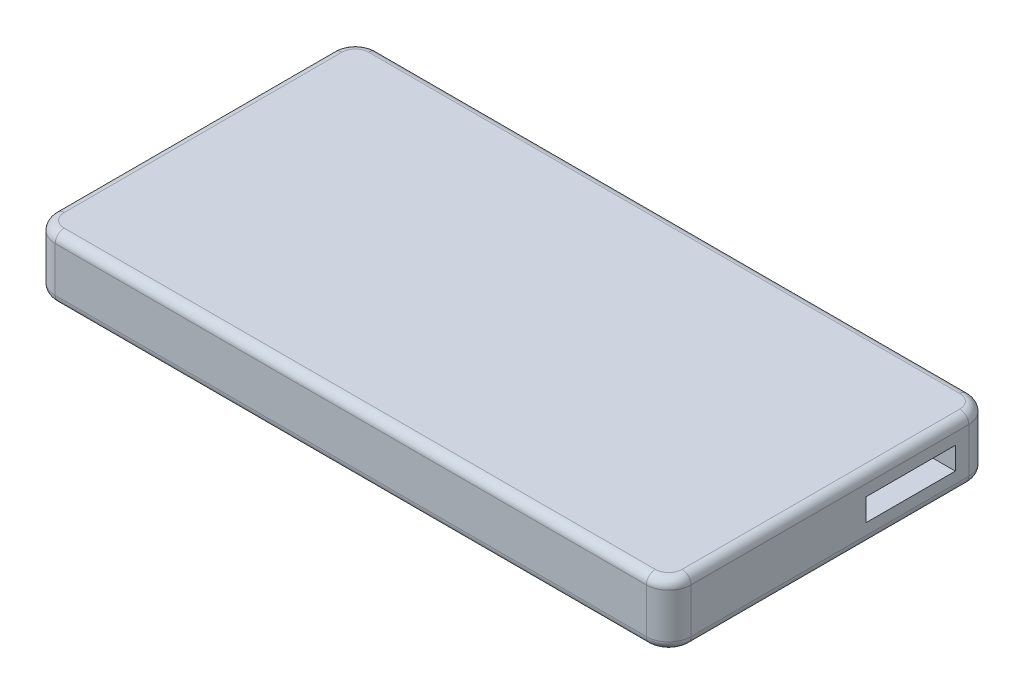
ISO-10303-21;
HEADER;
FILE_DESCRIPTION(('STEP AP214'),'2;1');
FILE_NAME('part.step','',(''),(''),'','','');
FILE_SCHEMA(('AUTOMOTIVE_DESIGN { 1 0 10303 214 1 1 1 1 }'));
ENDSEC;
DATA;
#1=APPLICATION_CONTEXT('core data for automotive mechanical design processes');
#2=APPLICATION_PROTOCOL_DEFINITION('international standard','automotive_design',2000,#1);
#3=PRODUCT_CONTEXT('',#1,'mechanical');
#4=PRODUCT('Part','Part','',(#3));
#5=PRODUCT_RELATED_PRODUCT_CATEGORY('part','',(#4));
#6=PRODUCT_DEFINITION_FORMATION('','',#4);
#7=PRODUCT_DEFINITION_CONTEXT('part definition',#1,'design');
#8=PRODUCT_DEFINITION('design','',#6,#7);
#9=PRODUCT_DEFINITION_SHAPE('','',#8);
#10=(LENGTH_UNIT() NAMED_UNIT(*) SI_UNIT(.MILLI.,.METRE.));
#11=(NAMED_UNIT(*) PLANE_ANGLE_UNIT() SI_UNIT($,.RADIAN.));
#12=(NAMED_UNIT(*) SI_UNIT($,.STERADIAN.) SOLID_ANGLE_UNIT());
#13=UNCERTAINTY_MEASURE_WITH_UNIT(LENGTH_MEASURE(1.E-05),#10,'distance_accuracy_value','');
#14=(GEOMETRIC_REPRESENTATION_CONTEXT(3) GLOBAL_UNCERTAINTY_ASSIGNED_CONTEXT((#13)) GLOBAL_UNIT_ASSIGNED_CONTEXT((#10,
#11,#12)) REPRESENTATION_CONTEXT('',''));
#15=CARTESIAN_POINT('',(0.,0.,0.));
#16=DIRECTION('',(0.,0.,1.));
#17=DIRECTION('',(1.,0.,0.));
#18=AXIS2_PLACEMENT_3D('',#15,#16,#17);
#19=CARTESIAN_POINT('',(-111.451663584206,8.99999999993741,-100.777598009267));
#20=DIRECTION('',(0.,-1.,0.));
#21=DIRECTION('',(0.,0.,-1.));
#22=AXIS2_PLACEMENT_3D('',#19,#20,#21);
#23=CYLINDRICAL_SURFACE('',#22,5.);
#24=DIRECTION('',(0.,-1.,0.));
#25=VECTOR('',#24,1.);
#26=CARTESIAN_POINT('',(-111.451663584206,8.99999999993751,-105.777598009267));
#27=LINE('',#26,#25);
#28=CARTESIAN_POINT('',(-111.451663584206,6.99999999993751,-105.777598009267));
#29=VERTEX_POINT('',#28);
#30=CARTESIAN_POINT('',(-111.451663584206,-3.00000000006249,-105.777598009267));
#31=VERTEX_POINT('',#30);
#32=EDGE_CURVE('E216',#29,#31,#27,.T.);
#33=ORIENTED_EDGE('',*,*,#32,.T.);
#34=CARTESIAN_POINT('',(-111.451663584206,-3.00000000006259,-100.777598009267));
#35=DIRECTION('',(0.,-1.,0.));
#36=DIRECTION('',(0.,0.,-1.));
#37=AXIS2_PLACEMENT_3D('',#34,#35,#36);
#38=CIRCLE('',#37,5.);
#39=CARTESIAN_POINT('',(-116.451663584206,-3.00000000006259,-100.777598009267));
#40=VERTEX_POINT('',#39);
#41=EDGE_CURVE('E282',#31,#40,#38,.F.);
#42=ORIENTED_EDGE('',*,*,#41,.T.);
#43=DIRECTION('',(0.,-1.,0.));
#44=VECTOR('',#43,1.);
#45=CARTESIAN_POINT('',(-116.451663584206,8.99999999993741,-100.777598009267));
#46=LINE('',#45,#44);
#47=CARTESIAN_POINT('',(-116.451663584206,6.99999999993741,-100.777598009267));
#48=VERTEX_POINT('',#47);
#49=EDGE_CURVE('E241',#48,#40,#46,.T.);
#50=ORIENTED_EDGE('',*,*,#49,.F.);
#51=CARTESIAN_POINT('',(-111.451663584206,6.99999999993741,-100.777598009267));
#52=DIRECTION('',(0.,-1.,0.));
#53=DIRECTION('',(0.,0.,-1.));
#54=AXIS2_PLACEMENT_3D('',#51,#52,#53);
#55=CIRCLE('',#54,5.);
#56=EDGE_CURVE('E279',#48,#29,#55,.T.);
#57=ORIENTED_EDGE('',*,*,#56,.T.);
#58=EDGE_LOOP('',(#33,#42,#50,#57));
#59=FACE_BOUND('',#58,.T.);
#60=ADVANCED_FACE('F37',(#59),#23,.T.);
#61=CARTESIAN_POINT('',(-116.451663584206,8.99999999993611,-38.7775980092671));
#62=DIRECTION('',(1.,0.,0.));
#63=DIRECTION('',(0.,1.,0.));
#64=AXIS2_PLACEMENT_3D('',#61,#62,#63);
#65=PLANE('',#64);
#66=ORIENTED_EDGE('',*,*,#49,.T.);
#67=DIRECTION('',(0.,0.,1.));
#68=VECTOR('',#67,1.);
#69=CARTESIAN_POINT('',(-116.451663584206,-3.00000000006389,-38.7775980092673));
#70=LINE('',#69,#68);
#71=CARTESIAN_POINT('',(-116.451663584206,-3.00000000006389,-38.7775980092673));
#72=VERTEX_POINT('',#71);
#73=EDGE_CURVE('E276',#40,#72,#70,.T.);
#74=ORIENTED_EDGE('',*,*,#73,.T.);
#75=DIRECTION('',(0.,-1.,0.));
#76=VECTOR('',#75,1.);
#77=CARTESIAN_POINT('',(-116.451663584206,8.99999999993611,-38.7775980092671));
#78=LINE('',#77,#76);
#79=CARTESIAN_POINT('',(-116.451663584206,6.99999999993611,-38.7775980092671));
#80=VERTEX_POINT('',#79);
#81=EDGE_CURVE('E238',#80,#72,#78,.T.);
#82=ORIENTED_EDGE('',*,*,#81,.F.);
#83=DIRECTION('',(0.,0.,1.));
#84=VECTOR('',#83,1.);
#85=CARTESIAN_POINT('',(-116.451663584206,6.99999999993611,-38.7775980092671));
#86=LINE('',#85,#84);
#87=EDGE_CURVE('E273',#80,#48,#86,.F.);
#88=ORIENTED_EDGE('',*,*,#87,.T.);
#89=EDGE_LOOP('',(#66,#74,#82,#88));
#90=FACE_BOUND('',#89,.T.);
#91=ADVANCED_FACE('F433',(#90),#65,.F.);
#92=CARTESIAN_POINT('',(-111.451663584206,8.99999999993611,-38.777598009267));
#93=DIRECTION('',(0.,-1.,0.));
#94=DIRECTION('',(0.,0.,-1.));
#95=AXIS2_PLACEMENT_3D('',#92,#93,#94);
#96=CYLINDRICAL_SURFACE('',#95,5.);
#97=ORIENTED_EDGE('',*,*,#81,.T.);
#98=CARTESIAN_POINT('',(-111.451663584206,-3.00000000006389,-38.7775980092673));
#99=DIRECTION('',(0.,-1.,0.));
#100=DIRECTION('',(0.,0.,-1.));
#101=AXIS2_PLACEMENT_3D('',#98,#99,#100);
#102=CIRCLE('',#101,5.);
#103=CARTESIAN_POINT('',(-111.451663584206,-3.000000000064,-33.7775980092673));
#104=VERTEX_POINT('',#103);
#105=EDGE_CURVE('E249',#72,#104,#102,.F.);
#106=ORIENTED_EDGE('',*,*,#105,.T.);
#107=DIRECTION('',(0.,-1.,0.));
#108=VECTOR('',#107,1.);
#109=CARTESIAN_POINT('',(-111.451663584206,8.999999999936,-33.777598009267));
#110=LINE('',#109,#108);
#111=CARTESIAN_POINT('',(-111.451663584206,6.999999999936,-33.7775980092671));
#112=VERTEX_POINT('',#111);
#113=EDGE_CURVE('E234',#112,#104,#110,.T.);
#114=ORIENTED_EDGE('',*,*,#113,.F.);
#115=CARTESIAN_POINT('',(-111.451663584206,6.99999999993611,-38.7775980092671));
#116=DIRECTION('',(0.,-1.,0.));
#117=DIRECTION('',(0.,0.,-1.));
#118=AXIS2_PLACEMENT_3D('',#115,#116,#117);
#119=CIRCLE('',#118,5.);
#120=EDGE_CURVE('E245',#112,#80,#119,.T.);
#121=ORIENTED_EDGE('',*,*,#120,.T.);
#122=EDGE_LOOP('',(#97,#106,#114,#121));
#123=FACE_BOUND('',#122,.T.);
#124=ADVANCED_FACE('F435',(#123),#96,.T.);
#125=CARTESIAN_POINT('',(-111.451663584206,8.999999999936,-33.777598009267));
#126=DIRECTION('',(0.,0.,-1.));
#127=DIRECTION('',(0.,1.,0.));
#128=AXIS2_PLACEMENT_3D('',#125,#126,#127);
#129=PLANE('',#128);
#130=ORIENTED_EDGE('',*,*,#113,.T.);
#131=DIRECTION('',(1.,0.,0.));
#132=VECTOR('',#131,1.);
#133=CARTESIAN_POINT('',(20.5483364157936,-3.00000000006401,-33.7775980092673));
#134=LINE('',#133,#132);
#135=CARTESIAN_POINT('',(20.5483364157936,-3.00000000006401,-33.7775980092673));
#136=VERTEX_POINT('',#135);
#137=EDGE_CURVE('E11',#104,#136,#134,.T.);
#138=ORIENTED_EDGE('',*,*,#137,.T.);
#139=DIRECTION('',(0.,-1.,0.));
#140=VECTOR('',#139,1.);
#141=CARTESIAN_POINT('',(20.5483364157936,8.99999999993599,-33.777598009267));
#142=LINE('',#141,#140);
#143=CARTESIAN_POINT('',(20.5483364157936,6.99999999993599,-33.7775980092671));
#144=VERTEX_POINT('',#143);
#145=EDGE_CURVE('E231',#144,#136,#142,.T.);
#146=ORIENTED_EDGE('',*,*,#145,.F.);
#147=DIRECTION('',(1.,0.,0.));
#148=VECTOR('',#147,1.);
#149=CARTESIAN_POINT('',(-111.451663584206,6.999999999936,-33.7775980092671));
#150=LINE('',#149,#148);
#151=EDGE_CURVE('E47',#144,#112,#150,.F.);
#152=ORIENTED_EDGE('',*,*,#151,.T.);
#153=EDGE_LOOP('',(#130,#138,#146,#152));
#154=FACE_BOUND('',#153,.T.);
#155=ADVANCED_FACE('F556',(#154),#129,.F.);
#156=CARTESIAN_POINT('',(20.5483364157937,8.9999999999361,-38.777598009267));
#157=DIRECTION('',(0.,-1.,0.));
#158=DIRECTION('',(0.,0.,-1.));
#159=AXIS2_PLACEMENT_3D('',#156,#157,#158);
#160=CYLINDRICAL_SURFACE('',#159,5.);
#161=ORIENTED_EDGE('',*,*,#145,.T.);
#162=CARTESIAN_POINT('',(20.5483364157937,-3.0000000000639,-38.7775980092673));
#163=DIRECTION('',(0.,-1.,0.));
#164=DIRECTION('',(0.,0.,-1.));
#165=AXIS2_PLACEMENT_3D('',#162,#163,#164);
#166=CIRCLE('',#165,5.);
#167=CARTESIAN_POINT('',(25.5483364157937,-3.0000000000639,-38.7775980092673));
#168=VERTEX_POINT('',#167);
#169=EDGE_CURVE('E304',#136,#168,#166,.F.);
#170=ORIENTED_EDGE('',*,*,#169,.T.);
#171=DIRECTION('',(0.,-1.,0.));
#172=VECTOR('',#171,1.);
#173=CARTESIAN_POINT('',(25.5483364157937,8.9999999999361,-38.7775980092671));
#174=LINE('',#173,#172);
#175=CARTESIAN_POINT('',(25.5483364157937,6.9999999999361,-38.7775980092671));
#176=VERTEX_POINT('',#175);
#177=EDGE_CURVE('E227',#176,#168,#174,.T.);
#178=ORIENTED_EDGE('',*,*,#177,.F.);
#179=CARTESIAN_POINT('',(20.5483364157937,6.9999999999361,-38.7775980092671));
#180=DIRECTION('',(0.,-1.,0.));
#181=DIRECTION('',(0.,0.,-1.));
#182=AXIS2_PLACEMENT_3D('',#179,#180,#181);
#183=CIRCLE('',#182,5.);
#184=EDGE_CURVE('E301',#176,#144,#183,.T.);
#185=ORIENTED_EDGE('',*,*,#184,.T.);
#186=EDGE_LOOP('',(#161,#170,#178,#185));
#187=FACE_BOUND('',#186,.T.);
#188=ADVANCED_FACE('F560',(#187),#160,.T.);
#189=CARTESIAN_POINT('',(25.5483364157937,8.9999999999361,-38.7775980092671));
#190=DIRECTION('',(-1.,0.,0.));
#191=DIRECTION('',(0.,-1.,0.));
#192=AXIS2_PLACEMENT_3D('',#189,#190,#191);
#193=PLANE('',#192);
#194=DIRECTION('',(0.,0.,1.));
#195=VECTOR('',#194,1.);
#196=CARTESIAN_POINT('',(25.5483364157937,4.4999999999375,-97.7775980092673));
#197=LINE('',#196,#195);
#198=CARTESIAN_POINT('',(25.5483364157937,4.4999999999375,-97.7775980092673));
#199=VERTEX_POINT('',#198);
#200=CARTESIAN_POINT('',(25.5483364157937,4.4999999999375,-77.7775980092673));
#201=VERTEX_POINT('',#200);
#202=EDGE_CURVE('E206',#199,#201,#197,.T.);
#203=ORIENTED_EDGE('',*,*,#202,.F.);
#204=DIRECTION('',(0.,1.,0.));
#205=VECTOR('',#204,1.);
#206=CARTESIAN_POINT('',(25.5483364157937,-0.500000000062495,-97.7775980092673));
#207=LINE('',#206,#205);
#208=CARTESIAN_POINT('',(25.5483364157937,-0.500000000062495,-97.7775980092673));
#209=VERTEX_POINT('',#208);
#210=EDGE_CURVE('E55',#209,#199,#207,.T.);
#211=ORIENTED_EDGE('',*,*,#210,.F.);
#212=DIRECTION('',(0.,0.,-1.));
#213=VECTOR('',#212,1.);
#214=CARTESIAN_POINT('',(25.5483364157937,-0.500000000062495,-97.7775980092673));
#215=LINE('',#214,#213);
#216=CARTESIAN_POINT('',(25.5483364157937,-0.500000000062497,-77.7775980092673));
#217=VERTEX_POINT('',#216);
#218=EDGE_CURVE('E197',#217,#209,#215,.T.);
#219=ORIENTED_EDGE('',*,*,#218,.F.);
#220=DIRECTION('',(0.,-1.,0.));
#221=VECTOR('',#220,1.);
#222=CARTESIAN_POINT('',(25.5483364157937,-0.500000000062497,-77.7775980092673));
#223=LINE('',#222,#221);
#224=EDGE_CURVE('E200',#201,#217,#223,.T.);
#225=ORIENTED_EDGE('',*,*,#224,.F.);
#226=EDGE_LOOP('',(#203,#211,#219,#225));
#227=FACE_BOUND('',#226,.T.);
#228=ORIENTED_EDGE('',*,*,#177,.T.);
#229=DIRECTION('',(0.,0.,-1.));
#230=VECTOR('',#229,1.);
#231=CARTESIAN_POINT('',(25.5483364157937,-3.0000000000626,-100.777598009267));
#232=LINE('',#231,#230);
#233=CARTESIAN_POINT('',(25.5483364157937,-3.0000000000626,-100.777598009267));
#234=VERTEX_POINT('',#233);
#235=EDGE_CURVE('E298',#168,#234,#232,.T.);
#236=ORIENTED_EDGE('',*,*,#235,.T.);
#237=DIRECTION('',(0.,-1.,0.));
#238=VECTOR('',#237,1.);
#239=CARTESIAN_POINT('',(25.5483364157937,8.9999999999374,-100.777598009267));
#240=LINE('',#239,#238);
#241=CARTESIAN_POINT('',(25.5483364157937,6.9999999999374,-100.777598009267));
#242=VERTEX_POINT('',#241);
#243=EDGE_CURVE('E224',#242,#234,#240,.T.);
#244=ORIENTED_EDGE('',*,*,#243,.F.);
#245=DIRECTION('',(0.,0.,-1.));
#246=VECTOR('',#245,1.);
#247=CARTESIAN_POINT('',(25.5483364157937,6.9999999999361,-38.7775980092671));
#248=LINE('',#247,#246);
#249=EDGE_CURVE('E295',#242,#176,#248,.F.);
#250=ORIENTED_EDGE('',*,*,#249,.T.);
#251=EDGE_LOOP('',(#228,#236,#244,#250));
#252=FACE_BOUND('',#251,.T.);
#253=ADVANCED_FACE('F388',(#227,#252),#193,.F.);
#254=CARTESIAN_POINT('',(20.5483364157937,8.9999999999374,-100.777598009267));
#255=DIRECTION('',(0.,-1.,0.));
#256=DIRECTION('',(0.,0.,-1.));
#257=AXIS2_PLACEMENT_3D('',#254,#255,#256);
#258=CYLINDRICAL_SURFACE('',#257,5.);
#259=ORIENTED_EDGE('',*,*,#243,.T.);
#260=CARTESIAN_POINT('',(20.5483364157937,-3.0000000000626,-100.777598009267));
#261=DIRECTION('',(0.,-1.,0.));
#262=DIRECTION('',(0.,0.,-1.));
#263=AXIS2_PLACEMENT_3D('',#260,#261,#262);
#264=CIRCLE('',#263,5.);
#265=CARTESIAN_POINT('',(20.5483364157936,-3.00000000006249,-105.777598009267));
#266=VERTEX_POINT('',#265);
#267=EDGE_CURVE('E293',#234,#266,#264,.F.);
#268=ORIENTED_EDGE('',*,*,#267,.T.);
#269=DIRECTION('',(0.,-1.,0.));
#270=VECTOR('',#269,1.);
#271=CARTESIAN_POINT('',(20.5483364157936,8.99999999993751,-105.777598009267));
#272=LINE('',#271,#270);
#273=CARTESIAN_POINT('',(20.5483364157936,6.99999999993751,-105.777598009267));
#274=VERTEX_POINT('',#273);
#275=EDGE_CURVE('E219',#274,#266,#272,.T.);
#276=ORIENTED_EDGE('',*,*,#275,.F.);
#277=CARTESIAN_POINT('',(20.5483364157937,6.9999999999374,-100.777598009267));
#278=DIRECTION('',(0.,-1.,0.));
#279=DIRECTION('',(0.,0.,-1.));
#280=AXIS2_PLACEMENT_3D('',#277,#278,#279);
#281=CIRCLE('',#280,5.);
#282=EDGE_CURVE('E290',#274,#242,#281,.T.);
#283=ORIENTED_EDGE('',*,*,#282,.T.);
#284=EDGE_LOOP('',(#259,#268,#276,#283));
#285=FACE_BOUND('',#284,.T.);
#286=ADVANCED_FACE('F385',(#285),#258,.T.);
#287=CARTESIAN_POINT('',(-111.451663584206,8.99999999993751,-105.777598009267));
#288=DIRECTION('',(0.,0.,1.));
#289=DIRECTION('',(0.,-1.,0.));
#290=AXIS2_PLACEMENT_3D('',#287,#288,#289);
#291=PLANE('',#290);
#292=ORIENTED_EDGE('',*,*,#275,.T.);
#293=DIRECTION('',(-1.,0.,0.));
#294=VECTOR('',#293,1.);
#295=CARTESIAN_POINT('',(-111.451663584206,-3.00000000006249,-105.777598009267));
#296=LINE('',#295,#294);
#297=EDGE_CURVE('E287',#266,#31,#296,.T.);
#298=ORIENTED_EDGE('',*,*,#297,.T.);
#299=ORIENTED_EDGE('',*,*,#32,.F.);
#300=DIRECTION('',(-1.,0.,0.));
#301=VECTOR('',#300,1.);
#302=CARTESIAN_POINT('',(-111.451663584206,6.99999999993751,-105.777598009267));
#303=LINE('',#302,#301);
#304=EDGE_CURVE('E284',#29,#274,#303,.F.);
#305=ORIENTED_EDGE('',*,*,#304,.T.);
#306=EDGE_LOOP('',(#292,#298,#299,#305));
#307=FACE_BOUND('',#306,.T.);
#308=ADVANCED_FACE('F412',(#307),#291,.F.);
#309=CARTESIAN_POINT('',(-111.451663584206,8.99999999993741,-100.777598009267));
#310=DIRECTION('',(0.,-1.,0.));
#311=DIRECTION('',(0.,0.,-1.));
#312=AXIS2_PLACEMENT_3D('',#309,#310,#311);
#313=PLANE('',#312);
#314=DIRECTION('',(0.,0.,1.));
#315=VECTOR('',#314,1.);
#316=CARTESIAN_POINT('',(-114.451663584206,8.99999999993741,-100.777598009267));
#317=LINE('',#316,#315);
#318=CARTESIAN_POINT('',(-114.451663584206,8.99999999993741,-100.777598009267));
#319=VERTEX_POINT('',#318);
#320=CARTESIAN_POINT('',(-114.451663584206,8.99999999993611,-38.7775980092671));
#321=VERTEX_POINT('',#320);
#322=EDGE_CURVE('E63',#319,#321,#317,.T.);
#323=ORIENTED_EDGE('',*,*,#322,.T.);
#324=CARTESIAN_POINT('',(-111.451663584206,8.99999999993611,-38.777598009267));
#325=DIRECTION('',(0.,-1.,0.));
#326=DIRECTION('',(0.,0.,-1.));
#327=AXIS2_PLACEMENT_3D('',#324,#325,#326);
#328=CIRCLE('',#327,3.);
#329=CARTESIAN_POINT('',(-111.451663584206,8.99999999993604,-35.777598009267));
#330=VERTEX_POINT('',#329);
#331=EDGE_CURVE('E325',#321,#330,#328,.F.);
#332=ORIENTED_EDGE('',*,*,#331,.T.);
#333=DIRECTION('',(1.,0.,0.));
#334=VECTOR('',#333,1.);
#335=CARTESIAN_POINT('',(-111.451663584206,8.99999999993604,-35.777598009267));
#336=LINE('',#335,#334);
#337=CARTESIAN_POINT('',(20.5483364157936,8.99999999993604,-35.777598009267));
#338=VERTEX_POINT('',#337);
#339=EDGE_CURVE('E307',#330,#338,#336,.T.);
#340=ORIENTED_EDGE('',*,*,#339,.T.);
#341=CARTESIAN_POINT('',(20.5483364157937,8.9999999999361,-38.777598009267));
#342=DIRECTION('',(0.,-1.,0.));
#343=DIRECTION('',(0.,0.,-1.));
#344=AXIS2_PLACEMENT_3D('',#341,#342,#343);
#345=CIRCLE('',#344,3.);
#346=CARTESIAN_POINT('',(23.5483364157937,8.9999999999361,-38.7775980092671));
#347=VERTEX_POINT('',#346);
#348=EDGE_CURVE('E310',#338,#347,#345,.F.);
#349=ORIENTED_EDGE('',*,*,#348,.T.);
#350=DIRECTION('',(0.,0.,-1.));
#351=VECTOR('',#350,1.);
#352=CARTESIAN_POINT('',(23.5483364157937,8.9999999999374,-100.777598009267));
#353=LINE('',#352,#351);
#354=CARTESIAN_POINT('',(23.5483364157937,8.9999999999374,-100.777598009267));
#355=VERTEX_POINT('',#354);
#356=EDGE_CURVE('E312',#347,#355,#353,.T.);
#357=ORIENTED_EDGE('',*,*,#356,.T.);
#358=CARTESIAN_POINT('',(20.5483364157937,8.9999999999374,-100.777598009267));
#359=DIRECTION('',(0.,-1.,0.));
#360=DIRECTION('',(0.,0.,-1.));
#361=AXIS2_PLACEMENT_3D('',#358,#359,#360);
#362=CIRCLE('',#361,3.);
#363=CARTESIAN_POINT('',(20.5483364157936,8.99999999993747,-103.777598009267));
#364=VERTEX_POINT('',#363);
#365=EDGE_CURVE('E315',#355,#364,#362,.F.);
#366=ORIENTED_EDGE('',*,*,#365,.T.);
#367=DIRECTION('',(-1.,0.,0.));
#368=VECTOR('',#367,1.);
#369=CARTESIAN_POINT('',(-111.451663584206,8.99999999993747,-103.777598009267));
#370=LINE('',#369,#368);
#371=CARTESIAN_POINT('',(-111.451663584206,8.99999999993747,-103.777598009267));
#372=VERTEX_POINT('',#371);
#373=EDGE_CURVE('E318',#364,#372,#370,.T.);
#374=ORIENTED_EDGE('',*,*,#373,.T.);
#375=CARTESIAN_POINT('',(-111.451663584206,8.99999999993741,-100.777598009267));
#376=DIRECTION('',(0.,-1.,0.));
#377=DIRECTION('',(0.,0.,-1.));
#378=AXIS2_PLACEMENT_3D('',#375,#376,#377);
#379=CIRCLE('',#378,3.);
#380=EDGE_CURVE('E321',#372,#319,#379,.F.);
#381=ORIENTED_EDGE('',*,*,#380,.T.);
#382=EDGE_LOOP('',(#323,#332,#340,#349,#357,#366,#374,#381));
#383=FACE_BOUND('',#382,.T.);
#384=ADVANCED_FACE('F449',(#383),#313,.F.);
#385=CARTESIAN_POINT('',(-111.451663584206,-5.00000000006259,-100.777598009267));
#386=DIRECTION('',(0.,-1.,0.));
#387=DIRECTION('',(0.,0.,-1.));
#388=AXIS2_PLACEMENT_3D('',#385,#386,#387);
#389=PLANE('',#388);
#390=DIRECTION('',(1.,0.,0.));
#391=VECTOR('',#390,1.);
#392=CARTESIAN_POINT('',(-111.451663584206,-5.00000000006396,-35.7775980092673));
#393=LINE('',#392,#391);
#394=CARTESIAN_POINT('',(20.5483364157936,-5.00000000006396,-35.7775980092673));
#395=VERTEX_POINT('',#394);
#396=CARTESIAN_POINT('',(-111.451663584206,-5.00000000006396,-35.7775980092673));
#397=VERTEX_POINT('',#396);
#398=EDGE_CURVE('E252',#395,#397,#393,.F.);
#399=ORIENTED_EDGE('',*,*,#398,.T.);
#400=CARTESIAN_POINT('',(-111.451663584206,-5.00000000006389,-38.7775980092673));
#401=DIRECTION('',(0.,-1.,0.));
#402=DIRECTION('',(0.,0.,-1.));
#403=AXIS2_PLACEMENT_3D('',#400,#401,#402);
#404=CIRCLE('',#403,3.);
#405=CARTESIAN_POINT('',(-114.451663584206,-5.00000000006389,-38.7775980092673));
#406=VERTEX_POINT('',#405);
#407=EDGE_CURVE('E269',#397,#406,#404,.T.);
#408=ORIENTED_EDGE('',*,*,#407,.T.);
#409=DIRECTION('',(0.,0.,1.));
#410=VECTOR('',#409,1.);
#411=CARTESIAN_POINT('',(-114.451663584206,-5.00000000006259,-100.777598009267));
#412=LINE('',#411,#410);
#413=CARTESIAN_POINT('',(-114.451663584206,-5.00000000006259,-100.777598009267));
#414=VERTEX_POINT('',#413);
#415=EDGE_CURVE('E266',#406,#414,#412,.F.);
#416=ORIENTED_EDGE('',*,*,#415,.T.);
#417=CARTESIAN_POINT('',(-111.451663584206,-5.00000000006259,-100.777598009267));
#418=DIRECTION('',(0.,-1.,0.));
#419=DIRECTION('',(0.,0.,-1.));
#420=AXIS2_PLACEMENT_3D('',#417,#418,#419);
#421=CIRCLE('',#420,3.);
#422=CARTESIAN_POINT('',(-111.451663584206,-5.00000000006253,-103.777598009267));
#423=VERTEX_POINT('',#422);
#424=EDGE_CURVE('E264',#414,#423,#421,.T.);
#425=ORIENTED_EDGE('',*,*,#424,.T.);
#426=DIRECTION('',(-1.,0.,0.));
#427=VECTOR('',#426,1.);
#428=CARTESIAN_POINT('',(20.5483364157936,-5.00000000006253,-103.777598009267));
#429=LINE('',#428,#427);
#430=CARTESIAN_POINT('',(20.5483364157936,-5.00000000006253,-103.777598009267));
#431=VERTEX_POINT('',#430);
#432=EDGE_CURVE('E262',#423,#431,#429,.F.);
#433=ORIENTED_EDGE('',*,*,#432,.T.);
#434=CARTESIAN_POINT('',(20.5483364157937,-5.0000000000626,-100.777598009267));
#435=DIRECTION('',(0.,-1.,0.));
#436=DIRECTION('',(0.,0.,-1.));
#437=AXIS2_PLACEMENT_3D('',#434,#435,#436);
#438=CIRCLE('',#437,3.);
#439=CARTESIAN_POINT('',(23.5483364157937,-5.0000000000626,-100.777598009267));
#440=VERTEX_POINT('',#439);
#441=EDGE_CURVE('E260',#431,#440,#438,.T.);
#442=ORIENTED_EDGE('',*,*,#441,.T.);
#443=DIRECTION('',(0.,0.,-1.));
#444=VECTOR('',#443,1.);
#445=CARTESIAN_POINT('',(23.5483364157937,-5.0000000000639,-38.7775980092674));
#446=LINE('',#445,#444);
#447=CARTESIAN_POINT('',(23.5483364157937,-5.0000000000639,-38.7775980092674));
#448=VERTEX_POINT('',#447);
#449=EDGE_CURVE('E257',#440,#448,#446,.F.);
#450=ORIENTED_EDGE('',*,*,#449,.T.);
#451=CARTESIAN_POINT('',(20.5483364157937,-5.0000000000639,-38.7775980092673));
#452=DIRECTION('',(0.,-1.,0.));
#453=DIRECTION('',(0.,0.,-1.));
#454=AXIS2_PLACEMENT_3D('',#451,#452,#453);
#455=CIRCLE('',#454,3.);
#456=EDGE_CURVE('E255',#448,#395,#455,.T.);
#457=ORIENTED_EDGE('',*,*,#456,.T.);
#458=EDGE_LOOP('',(#399,#408,#416,#425,#433,#442,#450,#457));
#459=FACE_BOUND('',#458,.T.);
#460=ADVANCED_FACE('F403',(#459),#389,.T.);
#461=CARTESIAN_POINT('',(20.5483364157937,-3.0000000000626,-100.777598009267));
#462=DIRECTION('',(0.,-1.,0.));
#463=DIRECTION('',(0.,0.,-1.));
#464=AXIS2_PLACEMENT_3D('',#461,#462,#463);
#465=TOROIDAL_SURFACE('',#464,3.,2.);
#466=CARTESIAN_POINT('',(23.5483364157937,-3.0000000000626,-100.777598009267));
#467=DIRECTION('',(0.,0.,1.));
#468=DIRECTION('',(0.,-1.,0.));
#469=AXIS2_PLACEMENT_3D('',#466,#467,#468);
#470=CIRCLE('',#469,2.);
#471=EDGE_CURVE('E347',#440,#234,#470,.T.);
#472=ORIENTED_EDGE('',*,*,#471,.F.);
#473=ORIENTED_EDGE('',*,*,#441,.F.);
#474=CARTESIAN_POINT('',(20.5483364157936,-3.00000000006254,-103.777598009267));
#475=DIRECTION('',(-1.,0.,0.));
#476=DIRECTION('',(0.,0.,1.));
#477=AXIS2_PLACEMENT_3D('',#474,#475,#476);
#478=CIRCLE('',#477,2.);
#479=EDGE_CURVE('E220',#266,#431,#478,.T.);
#480=ORIENTED_EDGE('',*,*,#479,.F.);
#481=ORIENTED_EDGE('',*,*,#267,.F.);
#482=EDGE_LOOP('',(#472,#473,#480,#481));
#483=FACE_BOUND('',#482,.T.);
#484=ADVANCED_FACE('F409',(#483),#465,.T.);
#485=CARTESIAN_POINT('',(-111.451663584206,-3.00000000006253,-103.777598009267));
#486=DIRECTION('',(1.,0.,0.));
#487=DIRECTION('',(0.,1.,0.));
#488=AXIS2_PLACEMENT_3D('',#485,#486,#487);
#489=CYLINDRICAL_SURFACE('',#488,2.);
#490=ORIENTED_EDGE('',*,*,#479,.T.);
#491=ORIENTED_EDGE('',*,*,#432,.F.);
#492=CARTESIAN_POINT('',(-111.451663584206,-3.00000000006253,-103.777598009267));
#493=DIRECTION('',(-1.,0.,0.));
#494=DIRECTION('',(0.,-1.,0.));
#495=AXIS2_PLACEMENT_3D('',#492,#493,#494);
#496=CIRCLE('',#495,2.);
#497=EDGE_CURVE('E344',#31,#423,#496,.T.);
#498=ORIENTED_EDGE('',*,*,#497,.F.);
#499=ORIENTED_EDGE('',*,*,#297,.F.);
#500=EDGE_LOOP('',(#490,#491,#498,#499));
#501=FACE_BOUND('',#500,.T.);
#502=ADVANCED_FACE('F420',(#501),#489,.T.);
#503=CARTESIAN_POINT('',(23.5483364157937,-3.0000000000639,-38.7775980092673));
#504=DIRECTION('',(0.,0.,1.));
#505=DIRECTION('',(0.,-1.,0.));
#506=AXIS2_PLACEMENT_3D('',#503,#504,#505);
#507=CYLINDRICAL_SURFACE('',#506,2.);
#508=ORIENTED_EDGE('',*,*,#471,.T.);
#509=ORIENTED_EDGE('',*,*,#235,.F.);
#510=CARTESIAN_POINT('',(23.5483364157937,-3.0000000000639,-38.7775980092673));
#511=DIRECTION('',(0.,0.,1.));
#512=DIRECTION('',(0.,-1.,0.));
#513=AXIS2_PLACEMENT_3D('',#510,#511,#512);
#514=CIRCLE('',#513,2.);
#515=EDGE_CURVE('E341',#448,#168,#514,.T.);
#516=ORIENTED_EDGE('',*,*,#515,.F.);
#517=ORIENTED_EDGE('',*,*,#449,.F.);
#518=EDGE_LOOP('',(#508,#509,#516,#517));
#519=FACE_BOUND('',#518,.T.);
#520=ADVANCED_FACE('F393',(#519),#507,.T.);
#521=CARTESIAN_POINT('',(-111.451663584206,-3.00000000006259,-100.777598009267));
#522=DIRECTION('',(0.,-1.,0.));
#523=DIRECTION('',(0.,0.,-1.));
#524=AXIS2_PLACEMENT_3D('',#521,#522,#523);
#525=TOROIDAL_SURFACE('',#524,3.,2.);
#526=ORIENTED_EDGE('',*,*,#497,.T.);
#527=ORIENTED_EDGE('',*,*,#424,.F.);
#528=CARTESIAN_POINT('',(-114.451663584206,-3.00000000006259,-100.777598009267));
#529=DIRECTION('',(0.,0.,1.));
#530=DIRECTION('',(0.,-1.,0.));
#531=AXIS2_PLACEMENT_3D('',#528,#529,#530);
#532=CIRCLE('',#531,2.);
#533=EDGE_CURVE('E338',#40,#414,#532,.T.);
#534=ORIENTED_EDGE('',*,*,#533,.F.);
#535=ORIENTED_EDGE('',*,*,#41,.F.);
#536=EDGE_LOOP('',(#526,#527,#534,#535));
#537=FACE_BOUND('',#536,.T.);
#538=ADVANCED_FACE('F424',(#537),#525,.T.);
#539=CARTESIAN_POINT('',(20.5483364157937,-3.0000000000639,-38.7775980092673));
#540=DIRECTION('',(0.,-1.,0.));
#541=DIRECTION('',(0.,0.,-1.));
#542=AXIS2_PLACEMENT_3D('',#539,#540,#541);
#543=TOROIDAL_SURFACE('',#542,3.,2.);
#544=ORIENTED_EDGE('',*,*,#515,.T.);
#545=ORIENTED_EDGE('',*,*,#169,.F.);
#546=CARTESIAN_POINT('',(20.5483364157936,-3.00000000006396,-35.7775980092673));
#547=DIRECTION('',(-1.,0.,0.));
#548=DIRECTION('',(0.,0.,1.));
#549=AXIS2_PLACEMENT_3D('',#546,#547,#548);
#550=CIRCLE('',#549,2.);
#551=EDGE_CURVE('E334',#395,#136,#550,.T.);
#552=ORIENTED_EDGE('',*,*,#551,.F.);
#553=ORIENTED_EDGE('',*,*,#456,.F.);
#554=EDGE_LOOP('',(#544,#545,#552,#553));
#555=FACE_BOUND('',#554,.T.);
#556=ADVANCED_FACE('F399',(#555),#543,.T.);
#557=CARTESIAN_POINT('',(-114.451663584206,-3.00000000006389,-38.7775980092673));
#558=DIRECTION('',(0.,0.,-1.));
#559=DIRECTION('',(0.,1.,0.));
#560=AXIS2_PLACEMENT_3D('',#557,#558,#559);
#561=CYLINDRICAL_SURFACE('',#560,2.);
#562=ORIENTED_EDGE('',*,*,#533,.T.);
#563=ORIENTED_EDGE('',*,*,#415,.F.);
#564=CARTESIAN_POINT('',(-114.451663584206,-3.00000000006389,-38.7775980092673));
#565=DIRECTION('',(0.,0.,1.));
#566=DIRECTION('',(0.,-1.,0.));
#567=AXIS2_PLACEMENT_3D('',#564,#565,#566);
#568=CIRCLE('',#567,2.);
#569=EDGE_CURVE('E332',#72,#406,#568,.T.);
#570=ORIENTED_EDGE('',*,*,#569,.F.);
#571=ORIENTED_EDGE('',*,*,#73,.F.);
#572=EDGE_LOOP('',(#562,#563,#570,#571));
#573=FACE_BOUND('',#572,.T.);
#574=ADVANCED_FACE('F429',(#573),#561,.T.);
#575=CARTESIAN_POINT('',(-111.451663584206,-3.00000000006396,-35.7775980092673));
#576=DIRECTION('',(-1.,0.,0.));
#577=DIRECTION('',(0.,-1.,0.));
#578=AXIS2_PLACEMENT_3D('',#575,#576,#577);
#579=CYLINDRICAL_SURFACE('',#578,2.);
#580=ORIENTED_EDGE('',*,*,#551,.T.);
#581=ORIENTED_EDGE('',*,*,#137,.F.);
#582=CARTESIAN_POINT('',(-111.451663584206,-3.00000000006396,-35.7775980092673));
#583=DIRECTION('',(-1.,0.,0.));
#584=DIRECTION('',(0.,0.,1.));
#585=AXIS2_PLACEMENT_3D('',#582,#583,#584);
#586=CIRCLE('',#585,2.);
#587=EDGE_CURVE('E330',#397,#104,#586,.T.);
#588=ORIENTED_EDGE('',*,*,#587,.F.);
#589=ORIENTED_EDGE('',*,*,#398,.F.);
#590=EDGE_LOOP('',(#580,#581,#588,#589));
#591=FACE_BOUND('',#590,.T.);
#592=ADVANCED_FACE('F470',(#591),#579,.T.);
#593=CARTESIAN_POINT('',(-111.451663584206,-3.00000000006389,-38.7775980092673));
#594=DIRECTION('',(0.,-1.,0.));
#595=DIRECTION('',(0.,0.,-1.));
#596=AXIS2_PLACEMENT_3D('',#593,#594,#595);
#597=TOROIDAL_SURFACE('',#596,3.,2.);
#598=ORIENTED_EDGE('',*,*,#569,.T.);
#599=ORIENTED_EDGE('',*,*,#407,.F.);
#600=ORIENTED_EDGE('',*,*,#587,.T.);
#601=ORIENTED_EDGE('',*,*,#105,.F.);
#602=EDGE_LOOP('',(#598,#599,#600,#601));
#603=FACE_BOUND('',#602,.T.);
#604=ADVANCED_FACE('F467',(#603),#597,.T.);
#605=CARTESIAN_POINT('',(20.5483364157937,6.9999999999374,-100.777598009267));
#606=DIRECTION('',(0.,-1.,0.));
#607=DIRECTION('',(0.,0.,-1.));
#608=AXIS2_PLACEMENT_3D('',#605,#606,#607);
#609=TOROIDAL_SURFACE('',#608,3.,2.);
#610=CARTESIAN_POINT('',(23.5483364157937,6.9999999999374,-100.777598009267));
#611=DIRECTION('',(0.,0.,1.));
#612=DIRECTION('',(0.,-1.,0.));
#613=AXIS2_PLACEMENT_3D('',#610,#611,#612);
#614=CIRCLE('',#613,2.);
#615=EDGE_CURVE('E366',#242,#355,#614,.T.);
#616=ORIENTED_EDGE('',*,*,#615,.F.);
#617=ORIENTED_EDGE('',*,*,#282,.F.);
#618=CARTESIAN_POINT('',(20.5483364157936,6.99999999993746,-103.777598009267));
#619=DIRECTION('',(-1.,0.,0.));
#620=DIRECTION('',(0.,0.,1.));
#621=AXIS2_PLACEMENT_3D('',#618,#619,#620);
#622=CIRCLE('',#621,2.);
#623=EDGE_CURVE('E41',#364,#274,#622,.T.);
#624=ORIENTED_EDGE('',*,*,#623,.F.);
#625=ORIENTED_EDGE('',*,*,#365,.F.);
#626=EDGE_LOOP('',(#616,#617,#624,#625));
#627=FACE_BOUND('',#626,.T.);
#628=ADVANCED_FACE('F39',(#627),#609,.T.);
#629=CARTESIAN_POINT('',(-111.451663584206,6.99999999993747,-103.777598009267));
#630=DIRECTION('',(-1.,0.,0.));
#631=DIRECTION('',(0.,-1.,0.));
#632=AXIS2_PLACEMENT_3D('',#629,#630,#631);
#633=CYLINDRICAL_SURFACE('',#632,2.);
#634=ORIENTED_EDGE('',*,*,#623,.T.);
#635=ORIENTED_EDGE('',*,*,#304,.F.);
#636=CARTESIAN_POINT('',(-111.451663584206,6.99999999993747,-103.777598009267));
#637=DIRECTION('',(-1.,0.,0.));
#638=DIRECTION('',(0.,0.,1.));
#639=AXIS2_PLACEMENT_3D('',#636,#637,#638);
#640=CIRCLE('',#639,2.);
#641=EDGE_CURVE('E364',#372,#29,#640,.T.);
#642=ORIENTED_EDGE('',*,*,#641,.F.);
#643=ORIENTED_EDGE('',*,*,#373,.F.);
#644=EDGE_LOOP('',(#634,#635,#642,#643));
#645=FACE_BOUND('',#644,.T.);
#646=ADVANCED_FACE('F377',(#645),#633,.T.);
#647=CARTESIAN_POINT('',(23.5483364157937,6.9999999999374,-100.777598009267));
#648=DIRECTION('',(0.,0.,-1.));
#649=DIRECTION('',(0.,1.,0.));
#650=AXIS2_PLACEMENT_3D('',#647,#648,#649);
#651=CYLINDRICAL_SURFACE('',#650,2.);
#652=ORIENTED_EDGE('',*,*,#615,.T.);
#653=ORIENTED_EDGE('',*,*,#356,.F.);
#654=CARTESIAN_POINT('',(23.5483364157937,6.9999999999361,-38.7775980092671));
#655=DIRECTION('',(0.,0.,1.));
#656=DIRECTION('',(0.,-1.,0.));
#657=AXIS2_PLACEMENT_3D('',#654,#655,#656);
#658=CIRCLE('',#657,2.);
#659=EDGE_CURVE('E361',#176,#347,#658,.T.);
#660=ORIENTED_EDGE('',*,*,#659,.F.);
#661=ORIENTED_EDGE('',*,*,#249,.F.);
#662=EDGE_LOOP('',(#652,#653,#660,#661));
#663=FACE_BOUND('',#662,.T.);
#664=ADVANCED_FACE('F502',(#663),#651,.T.);
#665=CARTESIAN_POINT('',(-111.451663584206,6.99999999993741,-100.777598009267));
#666=DIRECTION('',(0.,-1.,0.));
#667=DIRECTION('',(0.,0.,-1.));
#668=AXIS2_PLACEMENT_3D('',#665,#666,#667);
#669=TOROIDAL_SURFACE('',#668,3.,2.);
#670=ORIENTED_EDGE('',*,*,#641,.T.);
#671=ORIENTED_EDGE('',*,*,#56,.F.);
#672=CARTESIAN_POINT('',(-114.451663584206,6.99999999993741,-100.777598009267));
#673=DIRECTION('',(0.,0.,1.));
#674=DIRECTION('',(0.,-1.,0.));
#675=AXIS2_PLACEMENT_3D('',#672,#673,#674);
#676=CIRCLE('',#675,2.);
#677=EDGE_CURVE('E358',#319,#48,#676,.T.);
#678=ORIENTED_EDGE('',*,*,#677,.F.);
#679=ORIENTED_EDGE('',*,*,#380,.F.);
#680=EDGE_LOOP('',(#670,#671,#678,#679));
#681=FACE_BOUND('',#680,.T.);
#682=ADVANCED_FACE('F498',(#681),#669,.T.);
#683=CARTESIAN_POINT('',(20.5483364157937,6.9999999999361,-38.7775980092671));
#684=DIRECTION('',(0.,-1.,0.));
#685=DIRECTION('',(0.,0.,-1.));
#686=AXIS2_PLACEMENT_3D('',#683,#684,#685);
#687=TOROIDAL_SURFACE('',#686,3.,2.);
#688=ORIENTED_EDGE('',*,*,#659,.T.);
#689=ORIENTED_EDGE('',*,*,#348,.F.);
#690=CARTESIAN_POINT('',(20.5483364157936,6.99999999993604,-35.7775980092671));
#691=DIRECTION('',(-1.,0.,0.));
#692=DIRECTION('',(0.,0.,1.));
#693=AXIS2_PLACEMENT_3D('',#690,#691,#692);
#694=CIRCLE('',#693,2.);
#695=EDGE_CURVE('E355',#144,#338,#694,.T.);
#696=ORIENTED_EDGE('',*,*,#695,.F.);
#697=ORIENTED_EDGE('',*,*,#184,.F.);
#698=EDGE_LOOP('',(#688,#689,#696,#697));
#699=FACE_BOUND('',#698,.T.);
#700=ADVANCED_FACE('F494',(#699),#687,.T.);
#701=CARTESIAN_POINT('',(-114.451663584206,6.99999999993741,-100.777598009267));
#702=DIRECTION('',(0.,0.,1.));
#703=DIRECTION('',(0.,-1.,0.));
#704=AXIS2_PLACEMENT_3D('',#701,#702,#703);
#705=CYLINDRICAL_SURFACE('',#704,2.);
#706=ORIENTED_EDGE('',*,*,#677,.T.);
#707=ORIENTED_EDGE('',*,*,#87,.F.);
#708=CARTESIAN_POINT('',(-114.451663584206,6.99999999993611,-38.7775980092671));
#709=DIRECTION('',(0.,0.,1.));
#710=DIRECTION('',(0.,-1.,0.));
#711=AXIS2_PLACEMENT_3D('',#708,#709,#710);
#712=CIRCLE('',#711,2.);
#713=EDGE_CURVE('E353',#321,#80,#712,.T.);
#714=ORIENTED_EDGE('',*,*,#713,.F.);
#715=ORIENTED_EDGE('',*,*,#322,.F.);
#716=EDGE_LOOP('',(#706,#707,#714,#715));
#717=FACE_BOUND('',#716,.T.);
#718=ADVANCED_FACE('F491',(#717),#705,.T.);
#719=CARTESIAN_POINT('',(-111.451663584206,6.99999999993604,-35.7775980092671));
#720=DIRECTION('',(1.,0.,0.));
#721=DIRECTION('',(0.,1.,0.));
#722=AXIS2_PLACEMENT_3D('',#719,#720,#721);
#723=CYLINDRICAL_SURFACE('',#722,2.);
#724=ORIENTED_EDGE('',*,*,#695,.T.);
#725=ORIENTED_EDGE('',*,*,#339,.F.);
#726=CARTESIAN_POINT('',(-111.451663584206,6.99999999993604,-35.7775980092671));
#727=DIRECTION('',(-1.,0.,0.));
#728=DIRECTION('',(0.,-1.,0.));
#729=AXIS2_PLACEMENT_3D('',#726,#727,#728);
#730=CIRCLE('',#729,2.);
#731=EDGE_CURVE('E212',#112,#330,#730,.T.);
#732=ORIENTED_EDGE('',*,*,#731,.F.);
#733=ORIENTED_EDGE('',*,*,#151,.F.);
#734=EDGE_LOOP('',(#724,#725,#732,#733));
#735=FACE_BOUND('',#734,.T.);
#736=ADVANCED_FACE('F446',(#735),#723,.T.);
#737=CARTESIAN_POINT('',(-111.451663584206,6.99999999993611,-38.7775980092671));
#738=DIRECTION('',(0.,-1.,0.));
#739=DIRECTION('',(0.,0.,-1.));
#740=AXIS2_PLACEMENT_3D('',#737,#738,#739);
#741=TOROIDAL_SURFACE('',#740,3.,2.);
#742=ORIENTED_EDGE('',*,*,#713,.T.);
#743=ORIENTED_EDGE('',*,*,#120,.F.);
#744=ORIENTED_EDGE('',*,*,#731,.T.);
#745=ORIENTED_EDGE('',*,*,#331,.F.);
#746=EDGE_LOOP('',(#742,#743,#744,#745));
#747=FACE_BOUND('',#746,.T.);
#748=ADVANCED_FACE('F440',(#747),#741,.T.);
#749=CARTESIAN_POINT('',(5.54833641579366,-0.500000000062494,-97.7775980092673));
#750=DIRECTION('',(0.,0.,-1.));
#751=DIRECTION('',(-1.,0.,0.));
#752=AXIS2_PLACEMENT_3D('',#749,#750,#751);
#753=PLANE('',#752);
#754=ORIENTED_EDGE('',*,*,#210,.T.);
#755=DIRECTION('',(1.,0.,0.));
#756=VECTOR('',#755,1.);
#757=CARTESIAN_POINT('',(5.54833641579366,4.49999999993751,-97.7775980092673));
#758=LINE('',#757,#756);
#759=CARTESIAN_POINT('',(5.54833641579366,4.49999999993751,-97.7775980092673));
#760=VERTEX_POINT('',#759);
#761=EDGE_CURVE('E175',#760,#199,#758,.T.);
#762=ORIENTED_EDGE('',*,*,#761,.F.);
#763=DIRECTION('',(0.,1.,0.));
#764=VECTOR('',#763,1.);
#765=CARTESIAN_POINT('',(5.54833641579366,-0.500000000062494,-97.7775980092673));
#766=LINE('',#765,#764);
#767=CARTESIAN_POINT('',(5.54833641579366,-0.500000000062494,-97.7775980092673));
#768=VERTEX_POINT('',#767);
#769=EDGE_CURVE('E179',#768,#760,#766,.T.);
#770=ORIENTED_EDGE('',*,*,#769,.F.);
#771=DIRECTION('',(1.,0.,0.));
#772=VECTOR('',#771,1.);
#773=CARTESIAN_POINT('',(5.54833641579366,-0.500000000062494,-97.7775980092673));
#774=LINE('',#773,#772);
#775=EDGE_CURVE('E210',#768,#209,#774,.T.);
#776=ORIENTED_EDGE('',*,*,#775,.T.);
#777=EDGE_LOOP('',(#754,#762,#770,#776));
#778=FACE_BOUND('',#777,.T.);
#779=ADVANCED_FACE('F177',(#778),#753,.F.);
#780=CARTESIAN_POINT('',(5.54833641579366,-0.500000000062494,-97.7775980092673));
#781=DIRECTION('',(0.,-1.,0.));
#782=DIRECTION('',(0.,0.,-1.));
#783=AXIS2_PLACEMENT_3D('',#780,#781,#782);
#784=PLANE('',#783);
#785=ORIENTED_EDGE('',*,*,#218,.T.);
#786=ORIENTED_EDGE('',*,*,#775,.F.);
#787=DIRECTION('',(0.,0.,-1.));
#788=VECTOR('',#787,1.);
#789=CARTESIAN_POINT('',(5.54833641579366,-0.500000000062494,-97.7775980092673));
#790=LINE('',#789,#788);
#791=CARTESIAN_POINT('',(5.54833641579366,-0.500000000062496,-77.7775980092673));
#792=VERTEX_POINT('',#791);
#793=EDGE_CURVE('E185',#792,#768,#790,.T.);
#794=ORIENTED_EDGE('',*,*,#793,.F.);
#795=DIRECTION('',(1.,0.,0.));
#796=VECTOR('',#795,1.);
#797=CARTESIAN_POINT('',(5.54833641579366,-0.500000000062496,-77.7775980092673));
#798=LINE('',#797,#796);
#799=EDGE_CURVE('E213',#792,#217,#798,.T.);
#800=ORIENTED_EDGE('',*,*,#799,.T.);
#801=EDGE_LOOP('',(#785,#786,#794,#800));
#802=FACE_BOUND('',#801,.T.);
#803=ADVANCED_FACE('F708',(#802),#784,.F.);
#804=CARTESIAN_POINT('',(5.54833641579366,-0.500000000062496,-77.7775980092673));
#805=DIRECTION('',(0.,0.,1.));
#806=DIRECTION('',(1.,0.,0.));
#807=AXIS2_PLACEMENT_3D('',#804,#805,#806);
#808=PLANE('',#807);
#809=ORIENTED_EDGE('',*,*,#224,.T.);
#810=ORIENTED_EDGE('',*,*,#799,.F.);
#811=DIRECTION('',(0.,-1.,0.));
#812=VECTOR('',#811,1.);
#813=CARTESIAN_POINT('',(5.54833641579366,-0.500000000062496,-77.7775980092673));
#814=LINE('',#813,#812);
#815=CARTESIAN_POINT('',(5.54833641579366,4.4999999999375,-77.7775980092673));
#816=VERTEX_POINT('',#815);
#817=EDGE_CURVE('E193',#816,#792,#814,.T.);
#818=ORIENTED_EDGE('',*,*,#817,.F.);
#819=DIRECTION('',(1.,0.,0.));
#820=VECTOR('',#819,1.);
#821=CARTESIAN_POINT('',(5.54833641579366,4.4999999999375,-77.7775980092673));
#822=LINE('',#821,#820);
#823=EDGE_CURVE('E184',#816,#201,#822,.T.);
#824=ORIENTED_EDGE('',*,*,#823,.T.);
#825=EDGE_LOOP('',(#809,#810,#818,#824));
#826=FACE_BOUND('',#825,.T.);
#827=ADVANCED_FACE('F715',(#826),#808,.F.);
#828=CARTESIAN_POINT('',(5.54833641579366,4.49999999993751,-97.7775980092673));
#829=DIRECTION('',(0.,1.,0.));
#830=DIRECTION('',(0.,0.,1.));
#831=AXIS2_PLACEMENT_3D('',#828,#829,#830);
#832=PLANE('',#831);
#833=ORIENTED_EDGE('',*,*,#202,.T.);
#834=ORIENTED_EDGE('',*,*,#823,.F.);
#835=DIRECTION('',(0.,0.,1.));
#836=VECTOR('',#835,1.);
#837=CARTESIAN_POINT('',(5.54833641579366,4.49999999993751,-97.7775980092673));
#838=LINE('',#837,#836);
#839=EDGE_CURVE('E188',#760,#816,#838,.T.);
#840=ORIENTED_EDGE('',*,*,#839,.F.);
#841=ORIENTED_EDGE('',*,*,#761,.T.);
#842=EDGE_LOOP('',(#833,#834,#840,#841));
#843=FACE_BOUND('',#842,.T.);
#844=ADVANCED_FACE('F189',(#843),#832,.F.);
#845=CARTESIAN_POINT('',(5.54833641579366,0.,0.));
#846=DIRECTION('',(1.,0.,0.));
#847=DIRECTION('',(0.,0.,-1.));
#848=AXIS2_PLACEMENT_3D('',#845,#846,#847);
#849=PLANE('',#848);
#850=ORIENTED_EDGE('',*,*,#769,.T.);
#851=ORIENTED_EDGE('',*,*,#839,.T.);
#852=ORIENTED_EDGE('',*,*,#817,.T.);
#853=ORIENTED_EDGE('',*,*,#793,.T.);
#854=EDGE_LOOP('',(#850,#851,#852,#853));
#855=FACE_BOUND('',#854,.T.);
#856=ADVANCED_FACE('F195',(#855),#849,.T.);
#857=CLOSED_SHELL('',(#60,#91,#124,#155,#188,#253,#286,#308,#384,#460,#484,#502,#520,#538,#556,
#574,#592,#604,#628,#646,#664,#682,#700,#718,#736,#748,#779,#803,#827,#844,#856));
#858=MANIFOLD_SOLID_BREP('B2',#857);
#859=ADVANCED_BREP_SHAPE_REPRESENTATION('',(#18,#858),#14);
#860=SHAPE_DEFINITION_REPRESENTATION(#9,#859);
ENDSEC;
END-ISO-10303-21;
